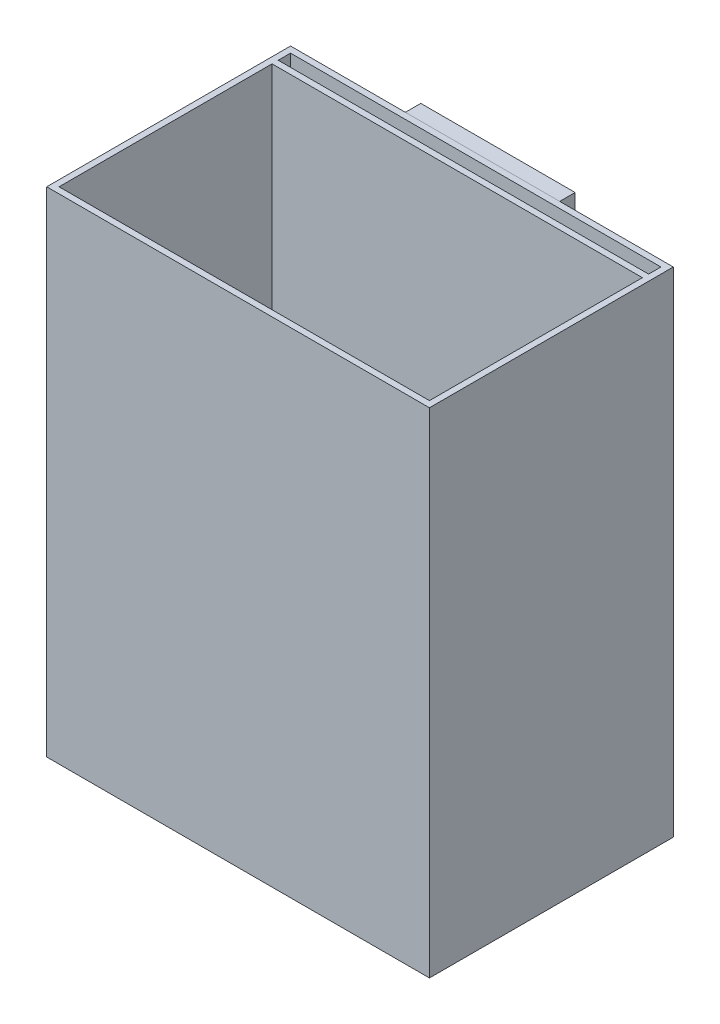
ISO-10303-21;
HEADER;
FILE_DESCRIPTION(('STEP AP214'),'2;1');
FILE_NAME('part.step','',(''),(''),'','','');
FILE_SCHEMA(('AUTOMOTIVE_DESIGN { 1 0 10303 214 1 1 1 1 }'));
ENDSEC;
DATA;
#1=APPLICATION_CONTEXT('core data for automotive mechanical design processes');
#2=APPLICATION_PROTOCOL_DEFINITION('international standard','automotive_design',2000,#1);
#3=PRODUCT_CONTEXT('',#1,'mechanical');
#4=PRODUCT('Part','Part','',(#3));
#5=PRODUCT_RELATED_PRODUCT_CATEGORY('part','',(#4));
#6=PRODUCT_DEFINITION_FORMATION('','',#4);
#7=PRODUCT_DEFINITION_CONTEXT('part definition',#1,'design');
#8=PRODUCT_DEFINITION('design','',#6,#7);
#9=PRODUCT_DEFINITION_SHAPE('','',#8);
#10=(LENGTH_UNIT() NAMED_UNIT(*) SI_UNIT(.MILLI.,.METRE.));
#11=(NAMED_UNIT(*) PLANE_ANGLE_UNIT() SI_UNIT($,.RADIAN.));
#12=(NAMED_UNIT(*) SI_UNIT($,.STERADIAN.) SOLID_ANGLE_UNIT());
#13=UNCERTAINTY_MEASURE_WITH_UNIT(LENGTH_MEASURE(1.E-05),#10,'distance_accuracy_value','');
#14=(GEOMETRIC_REPRESENTATION_CONTEXT(3) GLOBAL_UNCERTAINTY_ASSIGNED_CONTEXT((#13)) GLOBAL_UNIT_ASSIGNED_CONTEXT((#10,
#11,#12)) REPRESENTATION_CONTEXT('',''));
#15=CARTESIAN_POINT('',(0.,0.,0.));
#16=DIRECTION('',(0.,0.,1.));
#17=DIRECTION('',(1.,0.,0.));
#18=AXIS2_PLACEMENT_3D('',#15,#16,#17);
#19=CARTESIAN_POINT('',(6100.,0.,0.));
#20=DIRECTION('',(-1.,0.,0.));
#21=DIRECTION('',(0.,0.,1.));
#22=AXIS2_PLACEMENT_3D('',#19,#20,#21);
#23=PLANE('',#22);
#24=DIRECTION('',(0.,0.,1.));
#25=VECTOR('',#24,1.);
#26=CARTESIAN_POINT('',(6100.,8000.,3850.));
#27=LINE('',#26,#25);
#28=CARTESIAN_POINT('',(6100.,8000.,400.));
#29=VERTEX_POINT('',#28);
#30=CARTESIAN_POINT('',(6100.,8000.,3850.));
#31=VERTEX_POINT('',#30);
#32=EDGE_CURVE('E206',#29,#31,#27,.T.);
#33=ORIENTED_EDGE('',*,*,#32,.F.);
#34=DIRECTION('',(0.,-1.,0.));
#35=VECTOR('',#34,1.);
#36=CARTESIAN_POINT('',(6100.,8000.,400.));
#37=LINE('',#36,#35);
#38=CARTESIAN_POINT('',(6100.,1600.,400.));
#39=VERTEX_POINT('',#38);
#40=EDGE_CURVE('E170',#29,#39,#37,.T.);
#41=ORIENTED_EDGE('',*,*,#40,.T.);
#42=DIRECTION('',(0.,0.,1.));
#43=VECTOR('',#42,1.);
#44=CARTESIAN_POINT('',(6100.,1600.,300.));
#45=LINE('',#44,#43);
#46=CARTESIAN_POINT('',(6100.,1600.,3850.));
#47=VERTEX_POINT('',#46);
#48=EDGE_CURVE('E286',#39,#47,#45,.T.);
#49=ORIENTED_EDGE('',*,*,#48,.T.);
#50=DIRECTION('',(0.,-1.,0.));
#51=VECTOR('',#50,1.);
#52=CARTESIAN_POINT('',(6100.,100.,3850.));
#53=LINE('',#52,#51);
#54=EDGE_CURVE('E193',#31,#47,#53,.T.);
#55=ORIENTED_EDGE('',*,*,#54,.F.);
#56=EDGE_LOOP('',(#33,#41,#49,#55));
#57=FACE_BOUND('',#56,.T.);
#58=ADVANCED_FACE('F40',(#57),#23,.T.);
#59=DIRECTION('',(0.,-1.,0.));
#60=VECTOR('',#59,1.);
#61=CARTESIAN_POINT('',(6100.,1600.,300.));
#62=LINE('',#61,#60);
#63=CARTESIAN_POINT('',(6100.,8000.,300.));
#64=VERTEX_POINT('',#63);
#65=CARTESIAN_POINT('',(6100.,1401.72309910255,300.));
#66=VERTEX_POINT('',#65);
#67=EDGE_CURVE('E328',#64,#66,#62,.T.);
#68=ORIENTED_EDGE('',*,*,#67,.F.);
#69=CARTESIAN_POINT('',(6100.,8000.,100.));
#70=VERTEX_POINT('',#69);
#71=EDGE_CURVE('E207',#70,#64,#27,.T.);
#72=ORIENTED_EDGE('',*,*,#71,.F.);
#73=DIRECTION('',(0.,1.,0.));
#74=VECTOR('',#73,1.);
#75=CARTESIAN_POINT('',(6100.,100.,100.));
#76=LINE('',#75,#74);
#77=CARTESIAN_POINT('',(6100.,100.,100.));
#78=VERTEX_POINT('',#77);
#79=EDGE_CURVE('E203',#78,#70,#76,.T.);
#80=ORIENTED_EDGE('',*,*,#79,.F.);
#81=DIRECTION('',(0.,0.,-1.));
#82=VECTOR('',#81,1.);
#83=CARTESIAN_POINT('',(6100.,100.,3850.));
#84=LINE('',#83,#82);
#85=CARTESIAN_POINT('',(6100.,100.,3850.));
#86=VERTEX_POINT('',#85);
#87=EDGE_CURVE('E200',#86,#78,#84,.T.);
#88=ORIENTED_EDGE('',*,*,#87,.F.);
#89=CARTESIAN_POINT('',(6100.,1401.72309910255,3850.));
#90=VERTEX_POINT('',#89);
#91=EDGE_CURVE('E190',#90,#86,#53,.T.);
#92=ORIENTED_EDGE('',*,*,#91,.F.);
#93=DIRECTION('',(0.,0.,1.));
#94=VECTOR('',#93,1.);
#95=CARTESIAN_POINT('',(6100.,1401.72309910255,300.));
#96=LINE('',#95,#94);
#97=EDGE_CURVE('E55',#66,#90,#96,.T.);
#98=ORIENTED_EDGE('',*,*,#97,.F.);
#99=EDGE_LOOP('',(#68,#72,#80,#88,#92,#98));
#100=FACE_BOUND('',#99,.T.);
#101=ADVANCED_FACE('F278',(#100),#23,.T.);
#102=CARTESIAN_POINT('',(100.,0.,0.));
#103=DIRECTION('',(1.,0.,0.));
#104=DIRECTION('',(0.,0.,-1.));
#105=AXIS2_PLACEMENT_3D('',#102,#103,#104);
#106=PLANE('',#105);
#107=DIRECTION('',(0.,0.,-1.));
#108=VECTOR('',#107,1.);
#109=CARTESIAN_POINT('',(100.,1600.,0.));
#110=LINE('',#109,#108);
#111=CARTESIAN_POINT('',(100.,1600.,3850.));
#112=VERTEX_POINT('',#111);
#113=CARTESIAN_POINT('',(99.9999999999997,1600.,400.));
#114=VERTEX_POINT('',#113);
#115=EDGE_CURVE('E48',#112,#114,#110,.T.);
#116=ORIENTED_EDGE('',*,*,#115,.T.);
#117=DIRECTION('',(0.,-1.,0.));
#118=VECTOR('',#117,1.);
#119=CARTESIAN_POINT('',(100.,8000.,400.));
#120=LINE('',#119,#118);
#121=CARTESIAN_POINT('',(100.,8000.,400.));
#122=VERTEX_POINT('',#121);
#123=EDGE_CURVE('E167',#122,#114,#120,.T.);
#124=ORIENTED_EDGE('',*,*,#123,.F.);
#125=DIRECTION('',(0.,0.,-1.));
#126=VECTOR('',#125,1.);
#127=CARTESIAN_POINT('',(100.,8000.,100.));
#128=LINE('',#127,#126);
#129=CARTESIAN_POINT('',(100.,8000.,3850.));
#130=VERTEX_POINT('',#129);
#131=EDGE_CURVE('E182',#130,#122,#128,.T.);
#132=ORIENTED_EDGE('',*,*,#131,.F.);
#133=DIRECTION('',(0.,1.,0.));
#134=VECTOR('',#133,1.);
#135=CARTESIAN_POINT('',(100.,100.,3850.));
#136=LINE('',#135,#134);
#137=EDGE_CURVE('E317',#112,#130,#136,.T.);
#138=ORIENTED_EDGE('',*,*,#137,.F.);
#139=EDGE_LOOP('',(#116,#124,#132,#138));
#140=FACE_BOUND('',#139,.T.);
#141=ADVANCED_FACE('F180',(#140),#106,.T.);
#142=CARTESIAN_POINT('',(100.,8000.,300.));
#143=VERTEX_POINT('',#142);
#144=CARTESIAN_POINT('',(100.,8000.,100.));
#145=VERTEX_POINT('',#144);
#146=EDGE_CURVE('E191',#143,#145,#128,.T.);
#147=ORIENTED_EDGE('',*,*,#146,.F.);
#148=DIRECTION('',(0.,1.,0.));
#149=VECTOR('',#148,1.);
#150=CARTESIAN_POINT('',(100.,0.,300.));
#151=LINE('',#150,#149);
#152=CARTESIAN_POINT('',(100.,1401.72309910255,300.));
#153=VERTEX_POINT('',#152);
#154=EDGE_CURVE('E252',#153,#143,#151,.T.);
#155=ORIENTED_EDGE('',*,*,#154,.F.);
#156=DIRECTION('',(0.,0.,1.));
#157=VECTOR('',#156,1.);
#158=CARTESIAN_POINT('',(100.,1401.72309910255,0.));
#159=LINE('',#158,#157);
#160=CARTESIAN_POINT('',(100.,1401.72309910255,3850.));
#161=VERTEX_POINT('',#160);
#162=EDGE_CURVE('E11',#153,#161,#159,.T.);
#163=ORIENTED_EDGE('',*,*,#162,.T.);
#164=CARTESIAN_POINT('',(100.,100.,3850.));
#165=VERTEX_POINT('',#164);
#166=EDGE_CURVE('E195',#165,#161,#136,.T.);
#167=ORIENTED_EDGE('',*,*,#166,.F.);
#168=DIRECTION('',(0.,0.,1.));
#169=VECTOR('',#168,1.);
#170=CARTESIAN_POINT('',(100.,100.,100.));
#171=LINE('',#170,#169);
#172=CARTESIAN_POINT('',(100.,100.,100.));
#173=VERTEX_POINT('',#172);
#174=EDGE_CURVE('E271',#173,#165,#171,.T.);
#175=ORIENTED_EDGE('',*,*,#174,.F.);
#176=DIRECTION('',(0.,-1.,0.));
#177=VECTOR('',#176,1.);
#178=CARTESIAN_POINT('',(100.,100.,100.));
#179=LINE('',#178,#177);
#180=EDGE_CURVE('E269',#145,#173,#179,.T.);
#181=ORIENTED_EDGE('',*,*,#180,.F.);
#182=EDGE_LOOP('',(#147,#155,#163,#167,#175,#181));
#183=FACE_BOUND('',#182,.T.);
#184=ADVANCED_FACE('F267',(#183),#106,.T.);
#185=CARTESIAN_POINT('',(6100.,1600.,300.));
#186=DIRECTION('',(0.,-1.,0.));
#187=DIRECTION('',(1.,0.,0.));
#188=AXIS2_PLACEMENT_3D('',#185,#186,#187);
#189=PLANE('',#188);
#190=DIRECTION('',(1.,0.,0.));
#191=VECTOR('',#190,1.);
#192=CARTESIAN_POINT('',(99.9999999999997,1600.,400.));
#193=LINE('',#192,#191);
#194=EDGE_CURVE('E175',#114,#39,#193,.T.);
#195=ORIENTED_EDGE('',*,*,#194,.F.);
#196=ORIENTED_EDGE('',*,*,#115,.F.);
#197=DIRECTION('',(1.,0.,0.));
#198=VECTOR('',#197,1.);
#199=CARTESIAN_POINT('',(6100.,1600.,3850.));
#200=LINE('',#199,#198);
#201=EDGE_CURVE('E321',#112,#47,#200,.T.);
#202=ORIENTED_EDGE('',*,*,#201,.T.);
#203=ORIENTED_EDGE('',*,*,#48,.F.);
#204=EDGE_LOOP('',(#195,#196,#202,#203));
#205=FACE_BOUND('',#204,.T.);
#206=ADVANCED_FACE('F323',(#205),#189,.F.);
#207=CARTESIAN_POINT('',(0.,0.,3850.));
#208=DIRECTION('',(0.,0.,-1.));
#209=DIRECTION('',(-1.,0.,0.));
#210=AXIS2_PLACEMENT_3D('',#207,#208,#209);
#211=PLANE('',#210);
#212=ORIENTED_EDGE('',*,*,#166,.T.);
#213=DIRECTION('',(-1.,0.,0.));
#214=VECTOR('',#213,1.);
#215=CARTESIAN_POINT('',(6100.,1401.72309910255,3850.));
#216=LINE('',#215,#214);
#217=EDGE_CURVE('E63',#90,#161,#216,.T.);
#218=ORIENTED_EDGE('',*,*,#217,.F.);
#219=ORIENTED_EDGE('',*,*,#91,.T.);
#220=DIRECTION('',(1.,0.,0.));
#221=VECTOR('',#220,1.);
#222=CARTESIAN_POINT('',(0.,100.,3850.));
#223=LINE('',#222,#221);
#224=EDGE_CURVE('E249',#165,#86,#223,.T.);
#225=ORIENTED_EDGE('',*,*,#224,.F.);
#226=EDGE_LOOP('',(#212,#218,#219,#225));
#227=FACE_BOUND('',#226,.T.);
#228=ADVANCED_FACE('F282',(#227),#211,.T.);
#229=ORIENTED_EDGE('',*,*,#54,.T.);
#230=ORIENTED_EDGE('',*,*,#201,.F.);
#231=ORIENTED_EDGE('',*,*,#137,.T.);
#232=DIRECTION('',(-1.,0.,0.));
#233=VECTOR('',#232,1.);
#234=CARTESIAN_POINT('',(0.,8000.,3850.));
#235=LINE('',#234,#233);
#236=EDGE_CURVE('E189',#31,#130,#235,.T.);
#237=ORIENTED_EDGE('',*,*,#236,.F.);
#238=EDGE_LOOP('',(#229,#230,#231,#237));
#239=FACE_BOUND('',#238,.T.);
#240=ADVANCED_FACE('F319',(#239),#211,.T.);
#241=CARTESIAN_POINT('',(0.,0.,0.));
#242=DIRECTION('',(0.,0.,-1.));
#243=DIRECTION('',(-1.,0.,0.));
#244=AXIS2_PLACEMENT_3D('',#241,#242,#243);
#245=PLANE('',#244);
#246=DIRECTION('',(0.,-1.,0.));
#247=VECTOR('',#246,1.);
#248=CARTESIAN_POINT('',(0.,0.,0.));
#249=LINE('',#248,#247);
#250=CARTESIAN_POINT('',(0.,8000.,0.));
#251=VERTEX_POINT('',#250);
#252=CARTESIAN_POINT('',(0.,0.,0.));
#253=VERTEX_POINT('',#252);
#254=EDGE_CURVE('E224',#251,#253,#249,.T.);
#255=ORIENTED_EDGE('',*,*,#254,.F.);
#256=DIRECTION('',(-1.,0.,0.));
#257=VECTOR('',#256,1.);
#258=CARTESIAN_POINT('',(0.,8000.,0.));
#259=LINE('',#258,#257);
#260=CARTESIAN_POINT('',(6200.,8000.,0.));
#261=VERTEX_POINT('',#260);
#262=EDGE_CURVE('E231',#261,#251,#259,.T.);
#263=ORIENTED_EDGE('',*,*,#262,.F.);
#264=DIRECTION('',(0.,1.,0.));
#265=VECTOR('',#264,1.);
#266=CARTESIAN_POINT('',(6200.,0.,0.));
#267=LINE('',#266,#265);
#268=CARTESIAN_POINT('',(6200.,0.,0.));
#269=VERTEX_POINT('',#268);
#270=EDGE_CURVE('E237',#269,#261,#267,.T.);
#271=ORIENTED_EDGE('',*,*,#270,.F.);
#272=DIRECTION('',(1.,0.,0.));
#273=VECTOR('',#272,1.);
#274=CARTESIAN_POINT('',(0.,0.,0.));
#275=LINE('',#274,#273);
#276=EDGE_CURVE('E234',#253,#269,#275,.T.);
#277=ORIENTED_EDGE('',*,*,#276,.F.);
#278=EDGE_LOOP('',(#255,#263,#271,#277));
#279=FACE_BOUND('',#278,.T.);
#280=DIRECTION('',(-1.,0.,0.));
#281=VECTOR('',#280,1.);
#282=CARTESIAN_POINT('',(4350.,6190.,0.));
#283=LINE('',#282,#281);
#284=CARTESIAN_POINT('',(4350.,6190.,0.));
#285=VERTEX_POINT('',#284);
#286=CARTESIAN_POINT('',(1850.,6190.,0.));
#287=VERTEX_POINT('',#286);
#288=EDGE_CURVE('E289',#285,#287,#283,.T.);
#289=ORIENTED_EDGE('',*,*,#288,.F.);
#290=DIRECTION('',(0.,-1.,0.));
#291=VECTOR('',#290,1.);
#292=CARTESIAN_POINT('',(4350.,7990.,0.));
#293=LINE('',#292,#291);
#294=CARTESIAN_POINT('',(4350.,7990.,0.));
#295=VERTEX_POINT('',#294);
#296=EDGE_CURVE('E285',#295,#285,#293,.T.);
#297=ORIENTED_EDGE('',*,*,#296,.F.);
#298=DIRECTION('',(1.,0.,0.));
#299=VECTOR('',#298,1.);
#300=CARTESIAN_POINT('',(4350.,7990.,0.));
#301=LINE('',#300,#299);
#302=CARTESIAN_POINT('',(1850.,7990.,0.));
#303=VERTEX_POINT('',#302);
#304=EDGE_CURVE('E298',#303,#295,#301,.T.);
#305=ORIENTED_EDGE('',*,*,#304,.F.);
#306=DIRECTION('',(0.,1.,0.));
#307=VECTOR('',#306,1.);
#308=CARTESIAN_POINT('',(1850.,7990.,0.));
#309=LINE('',#308,#307);
#310=EDGE_CURVE('E306',#287,#303,#309,.T.);
#311=ORIENTED_EDGE('',*,*,#310,.F.);
#312=EDGE_LOOP('',(#289,#297,#305,#311));
#313=FACE_BOUND('',#312,.T.);
#314=ADVANCED_FACE('F352',(#279,#313),#245,.T.);
#315=CARTESIAN_POINT('',(0.,0.,100.));
#316=DIRECTION('',(0.,0.,-1.));
#317=DIRECTION('',(-1.,0.,0.));
#318=AXIS2_PLACEMENT_3D('',#315,#316,#317);
#319=PLANE('',#318);
#320=DIRECTION('',(-1.,0.,0.));
#321=VECTOR('',#320,1.);
#322=CARTESIAN_POINT('',(0.,8000.,100.));
#323=LINE('',#322,#321);
#324=EDGE_CURVE('E227',#70,#145,#323,.T.);
#325=ORIENTED_EDGE('',*,*,#324,.T.);
#326=ORIENTED_EDGE('',*,*,#180,.T.);
#327=DIRECTION('',(-1.,0.,0.));
#328=VECTOR('',#327,1.);
#329=CARTESIAN_POINT('',(0.,100.,100.));
#330=LINE('',#329,#328);
#331=EDGE_CURVE('E212',#78,#173,#330,.T.);
#332=ORIENTED_EDGE('',*,*,#331,.F.);
#333=ORIENTED_EDGE('',*,*,#79,.T.);
#334=EDGE_LOOP('',(#325,#326,#332,#333));
#335=FACE_BOUND('',#334,.T.);
#336=ADVANCED_FACE('F276',(#335),#319,.F.);
#337=CARTESIAN_POINT('',(0.,0.,100.));
#338=DIRECTION('',(1.,0.,0.));
#339=DIRECTION('',(0.,0.,-1.));
#340=AXIS2_PLACEMENT_3D('',#337,#338,#339);
#341=PLANE('',#340);
#342=DIRECTION('',(0.,-1.,0.));
#343=VECTOR('',#342,1.);
#344=CARTESIAN_POINT('',(0.,0.,3950.));
#345=LINE('',#344,#343);
#346=CARTESIAN_POINT('',(0.,8000.,3950.));
#347=VERTEX_POINT('',#346);
#348=CARTESIAN_POINT('',(0.,0.,3950.));
#349=VERTEX_POINT('',#348);
#350=EDGE_CURVE('E215',#347,#349,#345,.T.);
#351=ORIENTED_EDGE('',*,*,#350,.F.);
#352=DIRECTION('',(0.,0.,-1.));
#353=VECTOR('',#352,1.);
#354=CARTESIAN_POINT('',(0.,8000.,100.));
#355=LINE('',#354,#353);
#356=EDGE_CURVE('E230',#347,#251,#355,.T.);
#357=ORIENTED_EDGE('',*,*,#356,.T.);
#358=ORIENTED_EDGE('',*,*,#254,.T.);
#359=DIRECTION('',(0.,0.,-1.));
#360=VECTOR('',#359,1.);
#361=CARTESIAN_POINT('',(0.,0.,100.));
#362=LINE('',#361,#360);
#363=EDGE_CURVE('E247',#349,#253,#362,.T.);
#364=ORIENTED_EDGE('',*,*,#363,.F.);
#365=EDGE_LOOP('',(#351,#357,#358,#364));
#366=FACE_BOUND('',#365,.T.);
#367=ADVANCED_FACE('F42',(#366),#341,.F.);
#368=CARTESIAN_POINT('',(0.,0.,100.));
#369=DIRECTION('',(0.,1.,0.));
#370=DIRECTION('',(0.,0.,1.));
#371=AXIS2_PLACEMENT_3D('',#368,#369,#370);
#372=PLANE('',#371);
#373=ORIENTED_EDGE('',*,*,#276,.T.);
#374=DIRECTION('',(0.,0.,-1.));
#375=VECTOR('',#374,1.);
#376=CARTESIAN_POINT('',(6200.,0.,100.));
#377=LINE('',#376,#375);
#378=CARTESIAN_POINT('',(6200.,0.,3950.));
#379=VERTEX_POINT('',#378);
#380=EDGE_CURVE('E245',#379,#269,#377,.T.);
#381=ORIENTED_EDGE('',*,*,#380,.F.);
#382=DIRECTION('',(1.,0.,0.));
#383=VECTOR('',#382,1.);
#384=CARTESIAN_POINT('',(0.,0.,3950.));
#385=LINE('',#384,#383);
#386=EDGE_CURVE('E218',#349,#379,#385,.T.);
#387=ORIENTED_EDGE('',*,*,#386,.F.);
#388=ORIENTED_EDGE('',*,*,#363,.T.);
#389=EDGE_LOOP('',(#373,#381,#387,#388));
#390=FACE_BOUND('',#389,.T.);
#391=ADVANCED_FACE('F360',(#390),#372,.F.);
#392=CARTESIAN_POINT('',(6200.,0.,100.));
#393=DIRECTION('',(-1.,0.,0.));
#394=DIRECTION('',(0.,0.,1.));
#395=AXIS2_PLACEMENT_3D('',#392,#393,#394);
#396=PLANE('',#395);
#397=DIRECTION('',(0.,0.,-1.));
#398=VECTOR('',#397,1.);
#399=CARTESIAN_POINT('',(6200.,8000.,100.));
#400=LINE('',#399,#398);
#401=CARTESIAN_POINT('',(6200.,8000.,3950.));
#402=VERTEX_POINT('',#401);
#403=EDGE_CURVE('E242',#402,#261,#400,.T.);
#404=ORIENTED_EDGE('',*,*,#403,.F.);
#405=DIRECTION('',(0.,1.,0.));
#406=VECTOR('',#405,1.);
#407=CARTESIAN_POINT('',(6200.,0.,3950.));
#408=LINE('',#407,#406);
#409=EDGE_CURVE('E221',#379,#402,#408,.T.);
#410=ORIENTED_EDGE('',*,*,#409,.F.);
#411=ORIENTED_EDGE('',*,*,#380,.T.);
#412=ORIENTED_EDGE('',*,*,#270,.T.);
#413=EDGE_LOOP('',(#404,#410,#411,#412));
#414=FACE_BOUND('',#413,.T.);
#415=ADVANCED_FACE('F358',(#414),#396,.F.);
#416=CARTESIAN_POINT('',(0.,8000.,100.));
#417=DIRECTION('',(0.,-1.,0.));
#418=DIRECTION('',(0.,0.,-1.));
#419=AXIS2_PLACEMENT_3D('',#416,#417,#418);
#420=PLANE('',#419);
#421=ORIENTED_EDGE('',*,*,#131,.T.);
#422=DIRECTION('',(1.,0.,0.));
#423=VECTOR('',#422,1.);
#424=CARTESIAN_POINT('',(100.,8000.,400.));
#425=LINE('',#424,#423);
#426=EDGE_CURVE('E164',#122,#29,#425,.T.);
#427=ORIENTED_EDGE('',*,*,#426,.T.);
#428=ORIENTED_EDGE('',*,*,#32,.T.);
#429=ORIENTED_EDGE('',*,*,#236,.T.);
#430=EDGE_LOOP('',(#421,#427,#428,#429));
#431=FACE_BOUND('',#430,.T.);
#432=ORIENTED_EDGE('',*,*,#356,.F.);
#433=DIRECTION('',(-1.,0.,0.));
#434=VECTOR('',#433,1.);
#435=CARTESIAN_POINT('',(0.,8000.,3950.));
#436=LINE('',#435,#434);
#437=EDGE_CURVE('E210',#402,#347,#436,.T.);
#438=ORIENTED_EDGE('',*,*,#437,.F.);
#439=ORIENTED_EDGE('',*,*,#403,.T.);
#440=ORIENTED_EDGE('',*,*,#262,.T.);
#441=EDGE_LOOP('',(#432,#438,#439,#440));
#442=FACE_BOUND('',#441,.T.);
#443=DIRECTION('',(-1.,0.,0.));
#444=VECTOR('',#443,1.);
#445=CARTESIAN_POINT('',(100.,8000.,300.));
#446=LINE('',#445,#444);
#447=EDGE_CURVE('E174',#64,#143,#446,.T.);
#448=ORIENTED_EDGE('',*,*,#447,.T.);
#449=ORIENTED_EDGE('',*,*,#146,.T.);
#450=ORIENTED_EDGE('',*,*,#324,.F.);
#451=ORIENTED_EDGE('',*,*,#71,.T.);
#452=EDGE_LOOP('',(#448,#449,#450,#451));
#453=FACE_BOUND('',#452,.T.);
#454=ADVANCED_FACE('F186',(#431,#442,#453),#420,.F.);
#455=CARTESIAN_POINT('',(0.,100.,3950.));
#456=DIRECTION('',(0.,-1.,0.));
#457=DIRECTION('',(0.,0.,-1.));
#458=AXIS2_PLACEMENT_3D('',#455,#456,#457);
#459=PLANE('',#458);
#460=ORIENTED_EDGE('',*,*,#331,.T.);
#461=ORIENTED_EDGE('',*,*,#174,.T.);
#462=ORIENTED_EDGE('',*,*,#224,.T.);
#463=ORIENTED_EDGE('',*,*,#87,.T.);
#464=EDGE_LOOP('',(#460,#461,#462,#463));
#465=FACE_BOUND('',#464,.T.);
#466=ADVANCED_FACE('F280',(#465),#459,.F.);
#467=CARTESIAN_POINT('',(0.,0.,3950.));
#468=DIRECTION('',(0.,0.,-1.));
#469=DIRECTION('',(-1.,0.,0.));
#470=AXIS2_PLACEMENT_3D('',#467,#468,#469);
#471=PLANE('',#470);
#472=ORIENTED_EDGE('',*,*,#350,.T.);
#473=ORIENTED_EDGE('',*,*,#386,.T.);
#474=ORIENTED_EDGE('',*,*,#409,.T.);
#475=ORIENTED_EDGE('',*,*,#437,.T.);
#476=EDGE_LOOP('',(#472,#473,#474,#475));
#477=FACE_BOUND('',#476,.T.);
#478=ADVANCED_FACE('F343',(#477),#471,.F.);
#479=CARTESIAN_POINT('',(4350.,7990.,-260.));
#480=DIRECTION('',(-1.,0.,0.));
#481=DIRECTION('',(0.,0.,1.));
#482=AXIS2_PLACEMENT_3D('',#479,#480,#481);
#483=PLANE('',#482);
#484=ORIENTED_EDGE('',*,*,#296,.T.);
#485=DIRECTION('',(0.,0.,1.));
#486=VECTOR('',#485,1.);
#487=CARTESIAN_POINT('',(4350.,6190.,-260.));
#488=LINE('',#487,#486);
#489=CARTESIAN_POINT('',(4350.,6190.,-260.));
#490=VERTEX_POINT('',#489);
#491=EDGE_CURVE('E274',#490,#285,#488,.T.);
#492=ORIENTED_EDGE('',*,*,#491,.F.);
#493=DIRECTION('',(0.,-1.,0.));
#494=VECTOR('',#493,1.);
#495=CARTESIAN_POINT('',(4350.,7990.,-260.));
#496=LINE('',#495,#494);
#497=CARTESIAN_POINT('',(4350.,7990.,-260.));
#498=VERTEX_POINT('',#497);
#499=EDGE_CURVE('E294',#498,#490,#496,.T.);
#500=ORIENTED_EDGE('',*,*,#499,.F.);
#501=DIRECTION('',(0.,0.,1.));
#502=VECTOR('',#501,1.);
#503=CARTESIAN_POINT('',(4350.,7990.,-260.));
#504=LINE('',#503,#502);
#505=EDGE_CURVE('E303',#498,#295,#504,.T.);
#506=ORIENTED_EDGE('',*,*,#505,.T.);
#507=EDGE_LOOP('',(#484,#492,#500,#506));
#508=FACE_BOUND('',#507,.T.);
#509=ADVANCED_FACE('F346',(#508),#483,.F.);
#510=CARTESIAN_POINT('',(4350.,6190.,-260.));
#511=DIRECTION('',(0.,1.,0.));
#512=DIRECTION('',(0.,0.,1.));
#513=AXIS2_PLACEMENT_3D('',#510,#511,#512);
#514=PLANE('',#513);
#515=ORIENTED_EDGE('',*,*,#288,.T.);
#516=DIRECTION('',(0.,0.,1.));
#517=VECTOR('',#516,1.);
#518=CARTESIAN_POINT('',(1850.,6190.,-260.));
#519=LINE('',#518,#517);
#520=CARTESIAN_POINT('',(1850.,6190.,-260.));
#521=VERTEX_POINT('',#520);
#522=EDGE_CURVE('E314',#521,#287,#519,.T.);
#523=ORIENTED_EDGE('',*,*,#522,.F.);
#524=DIRECTION('',(-1.,0.,0.));
#525=VECTOR('',#524,1.);
#526=CARTESIAN_POINT('',(4350.,6190.,-260.));
#527=LINE('',#526,#525);
#528=EDGE_CURVE('E297',#490,#521,#527,.T.);
#529=ORIENTED_EDGE('',*,*,#528,.F.);
#530=ORIENTED_EDGE('',*,*,#491,.T.);
#531=EDGE_LOOP('',(#515,#523,#529,#530));
#532=FACE_BOUND('',#531,.T.);
#533=ADVANCED_FACE('F383',(#532),#514,.F.);
#534=CARTESIAN_POINT('',(1850.,7990.,-260.));
#535=DIRECTION('',(1.,0.,0.));
#536=DIRECTION('',(0.,1.,0.));
#537=AXIS2_PLACEMENT_3D('',#534,#535,#536);
#538=PLANE('',#537);
#539=ORIENTED_EDGE('',*,*,#310,.T.);
#540=DIRECTION('',(0.,0.,1.));
#541=VECTOR('',#540,1.);
#542=CARTESIAN_POINT('',(1850.,7990.,-260.));
#543=LINE('',#542,#541);
#544=CARTESIAN_POINT('',(1850.,7990.,-260.));
#545=VERTEX_POINT('',#544);
#546=EDGE_CURVE('E312',#545,#303,#543,.T.);
#547=ORIENTED_EDGE('',*,*,#546,.F.);
#548=DIRECTION('',(0.,1.,0.));
#549=VECTOR('',#548,1.);
#550=CARTESIAN_POINT('',(1850.,7990.,-260.));
#551=LINE('',#550,#549);
#552=EDGE_CURVE('E300',#521,#545,#551,.T.);
#553=ORIENTED_EDGE('',*,*,#552,.F.);
#554=ORIENTED_EDGE('',*,*,#522,.T.);
#555=EDGE_LOOP('',(#539,#547,#553,#554));
#556=FACE_BOUND('',#555,.T.);
#557=ADVANCED_FACE('F387',(#556),#538,.F.);
#558=CARTESIAN_POINT('',(4350.,7990.,-260.));
#559=DIRECTION('',(0.,-1.,0.));
#560=DIRECTION('',(0.,0.,-1.));
#561=AXIS2_PLACEMENT_3D('',#558,#559,#560);
#562=PLANE('',#561);
#563=ORIENTED_EDGE('',*,*,#304,.T.);
#564=ORIENTED_EDGE('',*,*,#505,.F.);
#565=DIRECTION('',(1.,0.,0.));
#566=VECTOR('',#565,1.);
#567=CARTESIAN_POINT('',(4350.,7990.,-260.));
#568=LINE('',#567,#566);
#569=EDGE_CURVE('E302',#545,#498,#568,.T.);
#570=ORIENTED_EDGE('',*,*,#569,.F.);
#571=ORIENTED_EDGE('',*,*,#546,.T.);
#572=EDGE_LOOP('',(#563,#564,#570,#571));
#573=FACE_BOUND('',#572,.T.);
#574=ADVANCED_FACE('F396',(#573),#562,.F.);
#575=CARTESIAN_POINT('',(0.,0.,-260.));
#576=DIRECTION('',(0.,0.,-1.));
#577=DIRECTION('',(-1.,0.,0.));
#578=AXIS2_PLACEMENT_3D('',#575,#576,#577);
#579=PLANE('',#578);
#580=ORIENTED_EDGE('',*,*,#499,.T.);
#581=ORIENTED_EDGE('',*,*,#528,.T.);
#582=ORIENTED_EDGE('',*,*,#552,.T.);
#583=ORIENTED_EDGE('',*,*,#569,.T.);
#584=EDGE_LOOP('',(#580,#581,#582,#583));
#585=FACE_BOUND('',#584,.T.);
#586=ADVANCED_FACE('F391',(#585),#579,.T.);
#587=CARTESIAN_POINT('',(6100.,1401.72309910255,300.));
#588=DIRECTION('',(0.,1.,0.));
#589=DIRECTION('',(0.,0.,1.));
#590=AXIS2_PLACEMENT_3D('',#587,#588,#589);
#591=PLANE('',#590);
#592=ORIENTED_EDGE('',*,*,#162,.F.);
#593=DIRECTION('',(-1.,0.,0.));
#594=VECTOR('',#593,1.);
#595=CARTESIAN_POINT('',(6100.,1401.72309910255,300.));
#596=LINE('',#595,#594);
#597=EDGE_CURVE('E259',#66,#153,#596,.T.);
#598=ORIENTED_EDGE('',*,*,#597,.F.);
#599=ORIENTED_EDGE('',*,*,#97,.T.);
#600=ORIENTED_EDGE('',*,*,#217,.T.);
#601=EDGE_LOOP('',(#592,#598,#599,#600));
#602=FACE_BOUND('',#601,.T.);
#603=ADVANCED_FACE('F284',(#602),#591,.F.);
#604=CARTESIAN_POINT('',(0.,0.,300.));
#605=DIRECTION('',(0.,0.,-1.));
#606=DIRECTION('',(-1.,0.,0.));
#607=AXIS2_PLACEMENT_3D('',#604,#605,#606);
#608=PLANE('',#607);
#609=ORIENTED_EDGE('',*,*,#597,.T.);
#610=ORIENTED_EDGE('',*,*,#154,.T.);
#611=ORIENTED_EDGE('',*,*,#447,.F.);
#612=ORIENTED_EDGE('',*,*,#67,.T.);
#613=EDGE_LOOP('',(#609,#610,#611,#612));
#614=FACE_BOUND('',#613,.T.);
#615=ADVANCED_FACE('F257',(#614),#608,.T.);
#616=CARTESIAN_POINT('',(100.,8000.,400.));
#617=DIRECTION('',(0.,0.,-1.));
#618=DIRECTION('',(-1.,0.,0.));
#619=AXIS2_PLACEMENT_3D('',#616,#617,#618);
#620=PLANE('',#619);
#621=ORIENTED_EDGE('',*,*,#194,.T.);
#622=ORIENTED_EDGE('',*,*,#40,.F.);
#623=ORIENTED_EDGE('',*,*,#426,.F.);
#624=ORIENTED_EDGE('',*,*,#123,.T.);
#625=EDGE_LOOP('',(#621,#622,#623,#624));
#626=FACE_BOUND('',#625,.T.);
#627=ADVANCED_FACE('F166',(#626),#620,.F.);
#628=CLOSED_SHELL('',(#58,#101,#141,#184,#206,#228,#240,#314,#336,#367,#391,#415,#454,#466,#478,
#509,#533,#557,#574,#586,#603,#615,#627));
#629=MANIFOLD_SOLID_BREP('B2',#628);
#630=ADVANCED_BREP_SHAPE_REPRESENTATION('',(#18,#629),#14);
#631=SHAPE_DEFINITION_REPRESENTATION(#9,#630);
ENDSEC;
END-ISO-10303-21;
